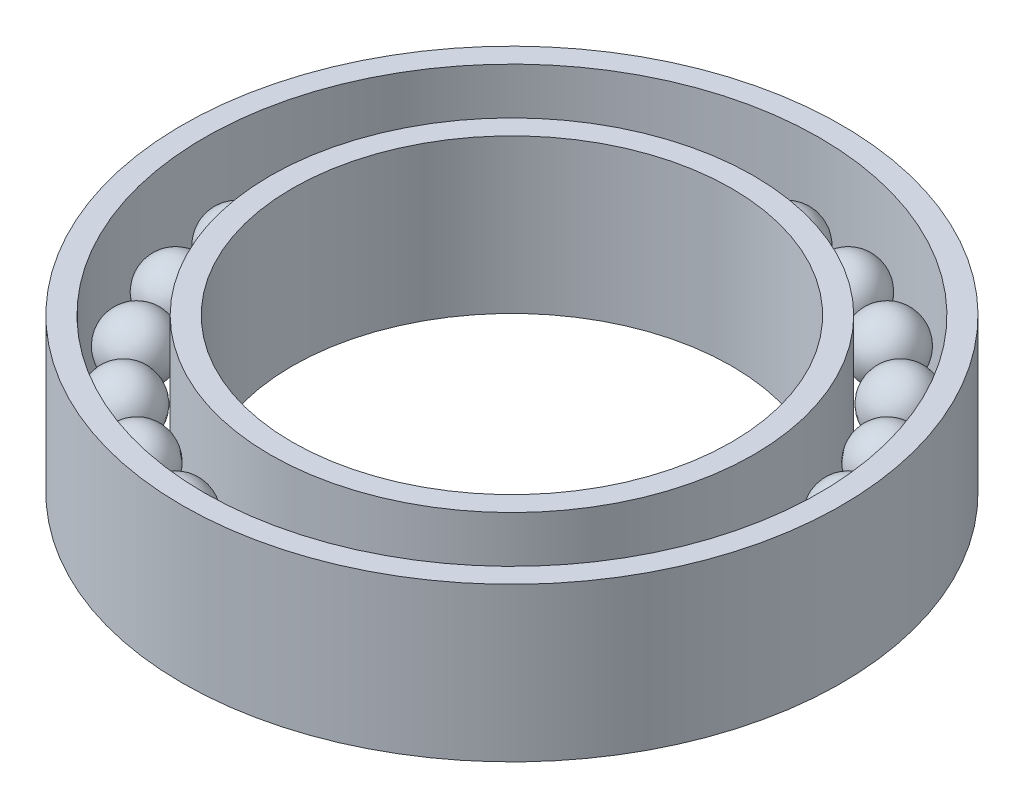
ISO-10303-21;
HEADER;
FILE_DESCRIPTION(('STEP AP214'),'2;1');
FILE_NAME('part.step','',(''),(''),'','','');
FILE_SCHEMA(('AUTOMOTIVE_DESIGN { 1 0 10303 214 1 1 1 1 }'));
ENDSEC;
DATA;
#1=APPLICATION_CONTEXT('core data for automotive mechanical design processes');
#2=APPLICATION_PROTOCOL_DEFINITION('international standard','automotive_design',2000,#1);
#3=PRODUCT_CONTEXT('',#1,'mechanical');
#4=PRODUCT('Part','Part','',(#3));
#5=PRODUCT_RELATED_PRODUCT_CATEGORY('part','',(#4));
#6=PRODUCT_DEFINITION_FORMATION('','',#4);
#7=PRODUCT_DEFINITION_CONTEXT('part definition',#1,'design');
#8=PRODUCT_DEFINITION('design','',#6,#7);
#9=PRODUCT_DEFINITION_SHAPE('','',#8);
#10=(LENGTH_UNIT() NAMED_UNIT(*) SI_UNIT(.MILLI.,.METRE.));
#11=(NAMED_UNIT(*) PLANE_ANGLE_UNIT() SI_UNIT($,.RADIAN.));
#12=(NAMED_UNIT(*) SI_UNIT($,.STERADIAN.) SOLID_ANGLE_UNIT());
#13=UNCERTAINTY_MEASURE_WITH_UNIT(LENGTH_MEASURE(1.E-05),#10,'distance_accuracy_value','');
#14=(GEOMETRIC_REPRESENTATION_CONTEXT(3) GLOBAL_UNCERTAINTY_ASSIGNED_CONTEXT((#13)) GLOBAL_UNIT_ASSIGNED_CONTEXT((#10,
#11,#12)) REPRESENTATION_CONTEXT('',''));
#15=CARTESIAN_POINT('',(0.,0.,0.));
#16=DIRECTION('',(0.,0.,1.));
#17=DIRECTION('',(1.,0.,0.));
#18=AXIS2_PLACEMENT_3D('',#15,#16,#17);
#19=CARTESIAN_POINT('',(0.,-3.5,0.));
#20=DIRECTION('',(0.,1.,0.));
#21=DIRECTION('',(0.,0.,1.));
#22=AXIS2_PLACEMENT_3D('',#19,#20,#21);
#23=CYLINDRICAL_SURFACE('',#22,14.);
#24=CARTESIAN_POINT('',(0.,-3.5,0.));
#25=DIRECTION('',(0.,1.,0.));
#26=DIRECTION('',(0.,0.,1.));
#27=AXIS2_PLACEMENT_3D('',#24,#25,#26);
#28=CIRCLE('',#27,14.);
#29=CARTESIAN_POINT('',(0.,-3.5,14.));
#30=VERTEX_POINT('',#29);
#31=EDGE_CURVE('P0_E21',#30,#30,#28,.T.);
#32=ORIENTED_EDGE('',*,*,#31,.F.);
#33=EDGE_LOOP('',(#32));
#34=FACE_BOUND('',#33,.T.);
#35=CARTESIAN_POINT('',(0.,3.5,0.));
#36=DIRECTION('',(0.,1.,0.));
#37=DIRECTION('',(0.,0.,1.));
#38=AXIS2_PLACEMENT_3D('',#35,#36,#37);
#39=CIRCLE('',#38,14.);
#40=CARTESIAN_POINT('',(0.,3.5,14.));
#41=VERTEX_POINT('',#40);
#42=EDGE_CURVE('P0_E32',#41,#41,#39,.T.);
#43=ORIENTED_EDGE('',*,*,#42,.T.);
#44=EDGE_LOOP('',(#43));
#45=FACE_BOUND('',#44,.T.);
#46=ADVANCED_FACE('P0_F14',(#34,#45),#23,.F.);
#47=CARTESIAN_POINT('',(0.,-3.5,0.));
#48=DIRECTION('',(0.,1.,0.));
#49=DIRECTION('',(0.,0.,1.));
#50=AXIS2_PLACEMENT_3D('',#47,#48,#49);
#51=CYLINDRICAL_SURFACE('',#50,15.);
#52=CARTESIAN_POINT('',(0.,-3.5,0.));
#53=DIRECTION('',(0.,1.,0.));
#54=DIRECTION('',(0.,0.,1.));
#55=AXIS2_PLACEMENT_3D('',#52,#53,#54);
#56=CIRCLE('',#55,15.);
#57=CARTESIAN_POINT('',(0.,-3.5,15.));
#58=VERTEX_POINT('',#57);
#59=EDGE_CURVE('P0_E9',#58,#58,#56,.T.);
#60=ORIENTED_EDGE('',*,*,#59,.T.);
#61=EDGE_LOOP('',(#60));
#62=FACE_BOUND('',#61,.T.);
#63=CARTESIAN_POINT('',(0.,3.5,0.));
#64=DIRECTION('',(0.,1.,0.));
#65=DIRECTION('',(0.,0.,1.));
#66=AXIS2_PLACEMENT_3D('',#63,#64,#65);
#67=CIRCLE('',#66,15.);
#68=CARTESIAN_POINT('',(0.,3.5,15.));
#69=VERTEX_POINT('',#68);
#70=EDGE_CURVE('P0_E27',#69,#69,#67,.T.);
#71=ORIENTED_EDGE('',*,*,#70,.F.);
#72=EDGE_LOOP('',(#71));
#73=FACE_BOUND('',#72,.T.);
#74=ADVANCED_FACE('P0_F47',(#62,#73),#51,.T.);
#75=CARTESIAN_POINT('',(0.,-3.5,0.));
#76=DIRECTION('',(0.,1.,0.));
#77=DIRECTION('',(0.,0.,1.));
#78=AXIS2_PLACEMENT_3D('',#75,#76,#77);
#79=PLANE('',#78);
#80=ORIENTED_EDGE('',*,*,#31,.T.);
#81=EDGE_LOOP('',(#80));
#82=FACE_BOUND('',#81,.T.);
#83=ORIENTED_EDGE('',*,*,#59,.F.);
#84=EDGE_LOOP('',(#83));
#85=FACE_BOUND('',#84,.T.);
#86=ADVANCED_FACE('P0_F43',(#82,#85),#79,.F.);
#87=CARTESIAN_POINT('',(0.,3.5,0.));
#88=DIRECTION('',(0.,1.,0.));
#89=DIRECTION('',(0.,0.,1.));
#90=AXIS2_PLACEMENT_3D('',#87,#88,#89);
#91=PLANE('',#90);
#92=ORIENTED_EDGE('',*,*,#42,.F.);
#93=EDGE_LOOP('',(#92));
#94=FACE_BOUND('',#93,.T.);
#95=ORIENTED_EDGE('',*,*,#70,.T.);
#96=EDGE_LOOP('',(#95));
#97=FACE_BOUND('',#96,.T.);
#98=ADVANCED_FACE('P0_F40',(#94,#97),#91,.T.);
#99=CLOSED_SHELL('',(#46,#74,#86,#98));
#100=MANIFOLD_SOLID_BREP('P0_B1',#99);
#101=CARTESIAN_POINT('',(-12.0740728286133,0.,3.23523806378156));
#102=DIRECTION('',(-0.258819045102525,0.,-0.965925826289067));
#103=DIRECTION('',(0.965925826289067,0.,-0.258819045102525));
#104=AXIS2_PLACEMENT_3D('',#101,#102,#103);
#105=SPHERICAL_SURFACE('',#104,1.46249191736685);
#106=CARTESIAN_POINT('',(-12.4525935901364,0.,1.8225793500579));
#107=VERTEX_POINT('',#106);
#108=VERTEX_LOOP('',#107);
#109=FACE_BOUND('',#108,.T.);
#110=ADVANCED_FACE('P1_F13',(#109),#105,.T.);
#111=CLOSED_SHELL('',(#110));
#112=MANIFOLD_SOLID_BREP('P1_B1',#111);
#113=CARTESIAN_POINT('',(-10.8253175473055,0.,6.25));
#114=DIRECTION('',(-0.5,0.,-0.866025403784437));
#115=DIRECTION('',(0.866025403784437,0.,-0.5));
#116=AXIS2_PLACEMENT_3D('',#113,#114,#115);
#117=SPHERICAL_SURFACE('',#116,1.46249191736685);
#118=CARTESIAN_POINT('',(-11.5565635059889,0.,4.9834448467309));
#119=VERTEX_POINT('',#118);
#120=VERTEX_LOOP('',#119);
#121=FACE_BOUND('',#120,.T.);
#122=ADVANCED_FACE('P2_F13',(#121),#117,.T.);
#123=CLOSED_SHELL('',(#122));
#124=MANIFOLD_SOLID_BREP('P2_B1',#123);
#125=CARTESIAN_POINT('',(-8.8388347648318,0.,8.83883476483189));
#126=DIRECTION('',(-0.707106781186551,0.,-0.707106781186544));
#127=DIRECTION('',(0.707106781186544,0.,-0.707106781186551));
#128=AXIS2_PLACEMENT_3D('',#125,#126,#127);
#129=SPHERICAL_SURFACE('',#128,1.46249191736685);
#130=CARTESIAN_POINT('',(-9.87297271703242,0.,7.80469681263128));
#131=VERTEX_POINT('',#130);
#132=VERTEX_LOOP('',#131);
#133=FACE_BOUND('',#132,.T.);
#134=ADVANCED_FACE('P3_F13',(#133),#129,.T.);
#135=CLOSED_SHELL('',(#134));
#136=MANIFOLD_SOLID_BREP('P3_B1',#135);
#137=CARTESIAN_POINT('',(-6.25,0.,10.8253175473055));
#138=DIRECTION('',(-0.866025403784442,0.,-0.5));
#139=DIRECTION('',(0.5,0.,-0.866025403784442));
#140=AXIS2_PLACEMENT_3D('',#137,#138,#139);
#141=SPHERICAL_SURFACE('',#140,1.46249191736685);
#142=CARTESIAN_POINT('',(-7.51655515326911,0.,10.0940715886221));
#143=VERTEX_POINT('',#142);
#144=VERTEX_LOOP('',#143);
#145=FACE_BOUND('',#144,.T.);
#146=ADVANCED_FACE('P4_F13',(#145),#141,.T.);
#147=CLOSED_SHELL('',(#146));
#148=MANIFOLD_SOLID_BREP('P4_B1',#147);
#149=CARTESIAN_POINT('',(-3.23523806378143,0.,12.0740728286134));
#150=DIRECTION('',(-0.96592582628907,0.,-0.258819045102515));
#151=DIRECTION('',(0.258819045102515,0.,-0.96592582628907));
#152=AXIS2_PLACEMENT_3D('',#149,#150,#151);
#153=SPHERICAL_SURFACE('',#152,1.46249191736685);
#154=CARTESIAN_POINT('',(-4.6478967775051,0.,11.6955520670903));
#155=VERTEX_POINT('',#154);
#156=VERTEX_LOOP('',#155);
#157=FACE_BOUND('',#156,.T.);
#158=ADVANCED_FACE('P5_F13',(#157),#153,.T.);
#159=CLOSED_SHELL('',(#158));
#160=MANIFOLD_SOLID_BREP('P5_B1',#159);
#161=CARTESIAN_POINT('',(0.,0.,12.5));
#162=DIRECTION('',(-1.,0.,0.));
#163=DIRECTION('',(0.,0.,-1.));
#164=AXIS2_PLACEMENT_3D('',#161,#162,#163);
#165=SPHERICAL_SURFACE('',#164,1.46249191736685);
#166=CARTESIAN_POINT('',(-1.46249191736685,0.,12.5));
#167=VERTEX_POINT('',#166);
#168=VERTEX_LOOP('',#167);
#169=FACE_BOUND('',#168,.T.);
#170=ADVANCED_FACE('P6_F13',(#169),#165,.T.);
#171=CLOSED_SHELL('',(#170));
#172=MANIFOLD_SOLID_BREP('P6_B1',#171);
#173=CARTESIAN_POINT('',(3.2352380637816,0.,12.0740728286133));
#174=DIRECTION('',(-0.965925826289066,0.,0.258819045102528));
#175=DIRECTION('',(-0.258819045102528,0.,-0.965925826289066));
#176=AXIS2_PLACEMENT_3D('',#173,#174,#175);
#177=SPHERICAL_SURFACE('',#176,1.46249191736685);
#178=CARTESIAN_POINT('',(1.82257935005794,0.,12.4525935901364));
#179=VERTEX_POINT('',#178);
#180=VERTEX_LOOP('',#179);
#181=FACE_BOUND('',#180,.T.);
#182=ADVANCED_FACE('P7_F13',(#181),#177,.T.);
#183=CLOSED_SHELL('',(#182));
#184=MANIFOLD_SOLID_BREP('P7_B1',#183);
#185=CARTESIAN_POINT('',(6.25000000000009,0.,10.8253175473054));
#186=DIRECTION('',(-0.866025403784435,0.,0.500000000000007));
#187=DIRECTION('',(-0.500000000000007,0.,-0.866025403784435));
#188=AXIS2_PLACEMENT_3D('',#185,#186,#187);
#189=SPHERICAL_SURFACE('',#188,1.46249191736685);
#190=CARTESIAN_POINT('',(4.98344484673099,0.,11.5565635059889));
#191=VERTEX_POINT('',#190);
#192=VERTEX_LOOP('',#191);
#193=FACE_BOUND('',#192,.T.);
#194=ADVANCED_FACE('P8_F13',(#193),#189,.T.);
#195=CLOSED_SHELL('',(#194));
#196=MANIFOLD_SOLID_BREP('P8_B1',#195);
#197=CARTESIAN_POINT('',(8.83883476483192,0.,8.83883476483177));
#198=DIRECTION('',(-0.707106781186541,0.,0.707106781186554));
#199=DIRECTION('',(-0.707106781186554,0.,-0.707106781186541));
#200=AXIS2_PLACEMENT_3D('',#197,#198,#199);
#201=SPHERICAL_SURFACE('',#200,1.46249191736685);
#202=CARTESIAN_POINT('',(7.80469681263131,0.,9.8729727170324));
#203=VERTEX_POINT('',#202);
#204=VERTEX_LOOP('',#203);
#205=FACE_BOUND('',#204,.T.);
#206=ADVANCED_FACE('P9_F13',(#205),#201,.T.);
#207=CLOSED_SHELL('',(#206));
#208=MANIFOLD_SOLID_BREP('P9_B1',#207);
#209=CARTESIAN_POINT('',(10.8253175473055,0.,6.2499999999999));
#210=DIRECTION('',(-0.499999999999992,0.,0.866025403784443));
#211=DIRECTION('',(-0.866025403784443,0.,-0.499999999999992));
#212=AXIS2_PLACEMENT_3D('',#209,#210,#211);
#213=SPHERICAL_SURFACE('',#212,1.46249191736685);
#214=CARTESIAN_POINT('',(10.0940715886221,0.,7.51655515326901));
#215=VERTEX_POINT('',#214);
#216=VERTEX_LOOP('',#215);
#217=FACE_BOUND('',#216,.T.);
#218=ADVANCED_FACE('P10_F13',(#217),#213,.T.);
#219=CLOSED_SHELL('',(#218));
#220=MANIFOLD_SOLID_BREP('P10_B1',#219);
#221=CARTESIAN_POINT('',(0.,-3.5,0.));
#222=DIRECTION('',(0.,1.,0.));
#223=DIRECTION('',(0.,0.,1.));
#224=AXIS2_PLACEMENT_3D('',#221,#222,#223);
#225=CYLINDRICAL_SURFACE('',#224,10.);
#226=CARTESIAN_POINT('',(0.,-3.5,0.));
#227=DIRECTION('',(0.,1.,0.));
#228=DIRECTION('',(0.,0.,1.));
#229=AXIS2_PLACEMENT_3D('',#226,#227,#228);
#230=CIRCLE('',#229,10.);
#231=CARTESIAN_POINT('',(0.,-3.5,10.));
#232=VERTEX_POINT('',#231);
#233=EDGE_CURVE('P11_E21',#232,#232,#230,.T.);
#234=ORIENTED_EDGE('',*,*,#233,.F.);
#235=EDGE_LOOP('',(#234));
#236=FACE_BOUND('',#235,.T.);
#237=CARTESIAN_POINT('',(0.,3.5,0.));
#238=DIRECTION('',(0.,1.,0.));
#239=DIRECTION('',(0.,0.,1.));
#240=AXIS2_PLACEMENT_3D('',#237,#238,#239);
#241=CIRCLE('',#240,10.);
#242=CARTESIAN_POINT('',(0.,3.5,10.));
#243=VERTEX_POINT('',#242);
#244=EDGE_CURVE('P11_E29',#243,#243,#241,.T.);
#245=ORIENTED_EDGE('',*,*,#244,.T.);
#246=EDGE_LOOP('',(#245));
#247=FACE_BOUND('',#246,.T.);
#248=ADVANCED_FACE('P11_F15',(#236,#247),#225,.F.);
#249=CARTESIAN_POINT('',(0.,-3.5,0.));
#250=DIRECTION('',(0.,1.,0.));
#251=DIRECTION('',(0.,0.,1.));
#252=AXIS2_PLACEMENT_3D('',#249,#250,#251);
#253=CYLINDRICAL_SURFACE('',#252,11.);
#254=CARTESIAN_POINT('',(0.,-3.5,0.));
#255=DIRECTION('',(0.,1.,0.));
#256=DIRECTION('',(0.,0.,1.));
#257=AXIS2_PLACEMENT_3D('',#254,#255,#256);
#258=CIRCLE('',#257,11.);
#259=CARTESIAN_POINT('',(0.,-3.5,11.));
#260=VERTEX_POINT('',#259);
#261=EDGE_CURVE('P11_E10',#260,#260,#258,.T.);
#262=ORIENTED_EDGE('',*,*,#261,.T.);
#263=EDGE_LOOP('',(#262));
#264=FACE_BOUND('',#263,.T.);
#265=CARTESIAN_POINT('',(0.,3.5,0.));
#266=DIRECTION('',(0.,1.,0.));
#267=DIRECTION('',(0.,0.,1.));
#268=AXIS2_PLACEMENT_3D('',#265,#266,#267);
#269=CIRCLE('',#268,11.);
#270=CARTESIAN_POINT('',(0.,3.5,11.));
#271=VERTEX_POINT('',#270);
#272=EDGE_CURVE('P11_E25',#271,#271,#269,.T.);
#273=ORIENTED_EDGE('',*,*,#272,.F.);
#274=EDGE_LOOP('',(#273));
#275=FACE_BOUND('',#274,.T.);
#276=ADVANCED_FACE('P11_F43',(#264,#275),#253,.T.);
#277=CARTESIAN_POINT('',(0.,-3.5,0.));
#278=DIRECTION('',(0.,1.,0.));
#279=DIRECTION('',(0.,0.,1.));
#280=AXIS2_PLACEMENT_3D('',#277,#278,#279);
#281=PLANE('',#280);
#282=ORIENTED_EDGE('',*,*,#233,.T.);
#283=EDGE_LOOP('',(#282));
#284=FACE_BOUND('',#283,.T.);
#285=ORIENTED_EDGE('',*,*,#261,.F.);
#286=EDGE_LOOP('',(#285));
#287=FACE_BOUND('',#286,.T.);
#288=ADVANCED_FACE('P11_F39',(#284,#287),#281,.F.);
#289=CARTESIAN_POINT('',(0.,3.5,0.));
#290=DIRECTION('',(0.,1.,0.));
#291=DIRECTION('',(0.,0.,1.));
#292=AXIS2_PLACEMENT_3D('',#289,#290,#291);
#293=PLANE('',#292);
#294=ORIENTED_EDGE('',*,*,#244,.F.);
#295=EDGE_LOOP('',(#294));
#296=FACE_BOUND('',#295,.T.);
#297=ORIENTED_EDGE('',*,*,#272,.T.);
#298=EDGE_LOOP('',(#297));
#299=FACE_BOUND('',#298,.T.);
#300=ADVANCED_FACE('P11_F36',(#296,#299),#293,.T.);
#301=CLOSED_SHELL('',(#248,#276,#288,#300));
#302=MANIFOLD_SOLID_BREP('P11_B1',#301);
#303=CARTESIAN_POINT('',(12.0740728286134,0.,3.23523806378139));
#304=DIRECTION('',(-0.258819045102511,0.,0.965925826289071));
#305=DIRECTION('',(-0.965925826289071,0.,-0.258819045102511));
#306=AXIS2_PLACEMENT_3D('',#303,#304,#305);
#307=SPHERICAL_SURFACE('',#306,1.46249191736685);
#308=CARTESIAN_POINT('',(11.6955520670904,0.,4.64789677750506));
#309=VERTEX_POINT('',#308);
#310=VERTEX_LOOP('',#309);
#311=FACE_BOUND('',#310,.T.);
#312=ADVANCED_FACE('P12_F13',(#311),#307,.T.);
#313=CLOSED_SHELL('',(#312));
#314=MANIFOLD_SOLID_BREP('P12_B1',#313);
#315=CARTESIAN_POINT('',(12.5,0.,-1.30930550206617E-13));
#316=DIRECTION('',(0.,0.,1.));
#317=DIRECTION('',(-1.,0.,0.));
#318=AXIS2_PLACEMENT_3D('',#315,#316,#317);
#319=SPHERICAL_SURFACE('',#318,1.46249191736685);
#320=CARTESIAN_POINT('',(12.5,0.,1.46249191736672));
#321=VERTEX_POINT('',#320);
#322=VERTEX_LOOP('',#321);
#323=FACE_BOUND('',#322,.T.);
#324=ADVANCED_FACE('P13_F13',(#323),#319,.T.);
#325=CLOSED_SHELL('',(#324));
#326=MANIFOLD_SOLID_BREP('P13_B1',#325);
#327=CARTESIAN_POINT('',(12.0740728286133,0.,-3.23523806378165));
#328=DIRECTION('',(0.258819045102532,0.,0.965925826289065));
#329=DIRECTION('',(-0.965925826289065,0.,0.258819045102532));
#330=AXIS2_PLACEMENT_3D('',#327,#328,#329);
#331=SPHERICAL_SURFACE('',#330,1.46249191736685);
#332=CARTESIAN_POINT('',(12.4525935901364,0.,-1.82257935005799));
#333=VERTEX_POINT('',#332);
#334=VERTEX_LOOP('',#333);
#335=FACE_BOUND('',#334,.T.);
#336=ADVANCED_FACE('P14_F13',(#335),#331,.T.);
#337=CLOSED_SHELL('',(#336));
#338=MANIFOLD_SOLID_BREP('P14_B1',#337);
#339=CARTESIAN_POINT('',(10.8253175473054,0.,-6.25000000000013));
#340=DIRECTION('',(0.50000000000001,0.,0.866025403784433));
#341=DIRECTION('',(-0.866025403784433,0.,0.50000000000001));
#342=AXIS2_PLACEMENT_3D('',#339,#340,#341);
#343=SPHERICAL_SURFACE('',#342,1.46249191736685);
#344=CARTESIAN_POINT('',(11.5565635059888,0.,-4.98344484673103));
#345=VERTEX_POINT('',#344);
#346=VERTEX_LOOP('',#345);
#347=FACE_BOUND('',#346,.T.);
#348=ADVANCED_FACE('P15_F13',(#347),#343,.T.);
#349=CLOSED_SHELL('',(#348));
#350=MANIFOLD_SOLID_BREP('P15_B1',#349);
#351=CARTESIAN_POINT('',(8.83883476483174,0.,-8.83883476483195));
#352=DIRECTION('',(0.707106781186556,0.,0.707106781186539));
#353=DIRECTION('',(-0.707106781186539,0.,0.707106781186556));
#354=AXIS2_PLACEMENT_3D('',#351,#352,#353);
#355=SPHERICAL_SURFACE('',#354,1.46249191736685);
#356=CARTESIAN_POINT('',(9.87297271703237,0.,-7.80469681263135));
#357=VERTEX_POINT('',#356);
#358=VERTEX_LOOP('',#357);
#359=FACE_BOUND('',#358,.T.);
#360=ADVANCED_FACE('P16_F13',(#359),#355,.T.);
#361=CLOSED_SHELL('',(#360));
#362=MANIFOLD_SOLID_BREP('P16_B1',#361);
#363=CARTESIAN_POINT('',(6.24999999999986,0.,-10.8253175473056));
#364=DIRECTION('',(0.866025403784445,0.,0.499999999999989));
#365=DIRECTION('',(-0.499999999999989,0.,0.866025403784445));
#366=AXIS2_PLACEMENT_3D('',#363,#364,#365);
#367=SPHERICAL_SURFACE('',#366,1.46249191736685);
#368=CARTESIAN_POINT('',(7.51655515326898,0.,-10.0940715886222));
#369=VERTEX_POINT('',#368);
#370=VERTEX_LOOP('',#369);
#371=FACE_BOUND('',#370,.T.);
#372=ADVANCED_FACE('P17_F13',(#371),#367,.T.);
#373=CLOSED_SHELL('',(#372));
#374=MANIFOLD_SOLID_BREP('P17_B1',#373);
#375=CARTESIAN_POINT('',(3.23523806378135,0.,-12.0740728286134));
#376=DIRECTION('',(0.965925826289072,0.,0.258819045102508));
#377=DIRECTION('',(-0.258819045102508,0.,0.965925826289072));
#378=AXIS2_PLACEMENT_3D('',#375,#376,#377);
#379=SPHERICAL_SURFACE('',#378,1.46249191736685);
#380=CARTESIAN_POINT('',(4.64789677750502,0.,-11.6955520670904));
#381=VERTEX_POINT('',#380);
#382=VERTEX_LOOP('',#381);
#383=FACE_BOUND('',#382,.T.);
#384=ADVANCED_FACE('P18_F13',(#383),#379,.T.);
#385=CLOSED_SHELL('',(#384));
#386=MANIFOLD_SOLID_BREP('P18_B1',#385);
#387=CARTESIAN_POINT('',(0.,0.,-12.5));
#388=DIRECTION('',(1.,0.,0.));
#389=DIRECTION('',(0.,0.,1.));
#390=AXIS2_PLACEMENT_3D('',#387,#388,#389);
#391=SPHERICAL_SURFACE('',#390,1.46249191736685);
#392=CARTESIAN_POINT('',(1.46249191736685,0.,-12.5));
#393=VERTEX_POINT('',#392);
#394=VERTEX_LOOP('',#393);
#395=FACE_BOUND('',#394,.T.);
#396=ADVANCED_FACE('P19_F13',(#395),#391,.T.);
#397=CLOSED_SHELL('',(#396));
#398=MANIFOLD_SOLID_BREP('P19_B1',#397);
#399=CARTESIAN_POINT('',(-3.23523806378169,0.,-12.0740728286133));
#400=DIRECTION('',(0.965925826289065,0.,-0.258819045102535));
#401=DIRECTION('',(0.258819045102535,0.,0.965925826289065));
#402=AXIS2_PLACEMENT_3D('',#399,#400,#401);
#403=SPHERICAL_SURFACE('',#402,1.46249191736685);
#404=CARTESIAN_POINT('',(-1.82257935005803,0.,-12.4525935901364));
#405=VERTEX_POINT('',#404);
#406=VERTEX_LOOP('',#405);
#407=FACE_BOUND('',#406,.T.);
#408=ADVANCED_FACE('P20_F13',(#407),#403,.T.);
#409=CLOSED_SHELL('',(#408));
#410=MANIFOLD_SOLID_BREP('P20_B1',#409);
#411=CARTESIAN_POINT('',(-6.25000000000017,0.,-10.8253175473054));
#412=DIRECTION('',(0.866025403784431,0.,-0.500000000000013));
#413=DIRECTION('',(0.500000000000013,0.,0.866025403784431));
#414=AXIS2_PLACEMENT_3D('',#411,#412,#413);
#415=SPHERICAL_SURFACE('',#414,1.46249191736685);
#416=CARTESIAN_POINT('',(-4.98344484673107,0.,-11.5565635059888));
#417=VERTEX_POINT('',#416);
#418=VERTEX_LOOP('',#417);
#419=FACE_BOUND('',#418,.T.);
#420=ADVANCED_FACE('P21_F13',(#419),#415,.T.);
#421=CLOSED_SHELL('',(#420));
#422=MANIFOLD_SOLID_BREP('P21_B1',#421);
#423=CARTESIAN_POINT('',(0.,0.,-12.5));
#424=DIRECTION('',(1.,0.,0.));
#425=DIRECTION('',(0.,0.,1.));
#426=AXIS2_PLACEMENT_3D('',#423,#424,#425);
#427=SPHERICAL_SURFACE('',#426,1.46249191736685);
#428=CARTESIAN_POINT('',(1.46249191736685,0.,-12.5));
#429=VERTEX_POINT('',#428);
#430=VERTEX_LOOP('',#429);
#431=FACE_BOUND('',#430,.T.);
#432=ADVANCED_FACE('P22_F13',(#431),#427,.T.);
#433=CLOSED_SHELL('',(#432));
#434=MANIFOLD_SOLID_BREP('P22_B1',#433);
#435=CARTESIAN_POINT('',(-8.83883476483198,0.,-8.83883476483171));
#436=DIRECTION('',(0.707106781186536,0.,-0.707106781186559));
#437=DIRECTION('',(0.707106781186559,0.,0.707106781186536));
#438=AXIS2_PLACEMENT_3D('',#435,#436,#437);
#439=SPHERICAL_SURFACE('',#438,1.46249191736685);
#440=CARTESIAN_POINT('',(-7.80469681263138,0.,-9.87297271703235));
#441=VERTEX_POINT('',#440);
#442=VERTEX_LOOP('',#441);
#443=FACE_BOUND('',#442,.T.);
#444=ADVANCED_FACE('P23_F13',(#443),#439,.T.);
#445=CLOSED_SHELL('',(#444));
#446=MANIFOLD_SOLID_BREP('P23_B1',#445);
#447=CARTESIAN_POINT('',(-10.8253175473056,0.,-6.24999999999982));
#448=DIRECTION('',(0.499999999999986,0.,-0.866025403784447));
#449=DIRECTION('',(0.866025403784447,0.,0.499999999999986));
#450=AXIS2_PLACEMENT_3D('',#447,#448,#449);
#451=SPHERICAL_SURFACE('',#450,1.46249191736685);
#452=CARTESIAN_POINT('',(-10.0940715886222,0.,-7.51655515326894));
#453=VERTEX_POINT('',#452);
#454=VERTEX_LOOP('',#453);
#455=FACE_BOUND('',#454,.T.);
#456=ADVANCED_FACE('P24_F13',(#455),#451,.T.);
#457=CLOSED_SHELL('',(#456));
#458=MANIFOLD_SOLID_BREP('P24_B1',#457);
#459=CARTESIAN_POINT('',(-12.0740728286134,0.,-3.2352380637813));
#460=DIRECTION('',(0.258819045102505,0.,-0.965925826289073));
#461=DIRECTION('',(0.965925826289073,0.,0.258819045102505));
#462=AXIS2_PLACEMENT_3D('',#459,#460,#461);
#463=SPHERICAL_SURFACE('',#462,1.46249191736685);
#464=CARTESIAN_POINT('',(-11.6955520670904,0.,-4.64789677750497));
#465=VERTEX_POINT('',#464);
#466=VERTEX_LOOP('',#465);
#467=FACE_BOUND('',#466,.T.);
#468=ADVANCED_FACE('P25_F13',(#467),#463,.T.);
#469=CLOSED_SHELL('',(#468));
#470=MANIFOLD_SOLID_BREP('P25_B1',#469);
#471=CARTESIAN_POINT('',(-6.25,0.,-10.8253175473055));
#472=DIRECTION('',(0.866025403784438,0.,-0.5));
#473=DIRECTION('',(0.5,0.,0.866025403784438));
#474=AXIS2_PLACEMENT_3D('',#471,#472,#473);
#475=SPHERICAL_SURFACE('',#474,1.46249191736685);
#476=CARTESIAN_POINT('',(-4.98344484673089,0.,-11.5565635059889));
#477=VERTEX_POINT('',#476);
#478=VERTEX_LOOP('',#477);
#479=FACE_BOUND('',#478,.T.);
#480=ADVANCED_FACE('P26_F13',(#479),#475,.T.);
#481=CLOSED_SHELL('',(#480));
#482=MANIFOLD_SOLID_BREP('P26_B1',#481);
#483=CARTESIAN_POINT('',(-8.83883476483186,0.,-8.83883476483183));
#484=DIRECTION('',(0.707106781186546,0.,-0.707106781186549));
#485=DIRECTION('',(0.707106781186549,0.,0.707106781186546));
#486=AXIS2_PLACEMENT_3D('',#483,#484,#485);
#487=SPHERICAL_SURFACE('',#486,1.46249191736685);
#488=CARTESIAN_POINT('',(-7.80469681263124,0.,-9.87297271703245));
#489=VERTEX_POINT('',#488);
#490=VERTEX_LOOP('',#489);
#491=FACE_BOUND('',#490,.T.);
#492=ADVANCED_FACE('P27_F13',(#491),#487,.T.);
#493=CLOSED_SHELL('',(#492));
#494=MANIFOLD_SOLID_BREP('P27_B1',#493);
#495=CARTESIAN_POINT('',(-10.8253175473055,0.,-6.25));
#496=DIRECTION('',(0.5,0.,-0.86602540378444));
#497=DIRECTION('',(0.86602540378444,0.,0.5));
#498=AXIS2_PLACEMENT_3D('',#495,#496,#497);
#499=SPHERICAL_SURFACE('',#498,1.46249191736685);
#500=CARTESIAN_POINT('',(-10.0940715886221,0.,-7.51655515326911));
#501=VERTEX_POINT('',#500);
#502=VERTEX_LOOP('',#501);
#503=FACE_BOUND('',#502,.T.);
#504=ADVANCED_FACE('P28_F13',(#503),#499,.T.);
#505=CLOSED_SHELL('',(#504));
#506=MANIFOLD_SOLID_BREP('P28_B1',#505);
#507=CARTESIAN_POINT('',(-12.0740728286134,0.,-3.23523806378148));
#508=DIRECTION('',(0.258819045102518,0.,-0.965925826289069));
#509=DIRECTION('',(0.965925826289069,0.,0.258819045102518));
#510=AXIS2_PLACEMENT_3D('',#507,#508,#509);
#511=SPHERICAL_SURFACE('',#510,1.46249191736685);
#512=CARTESIAN_POINT('',(-11.6955520670903,0.,-4.64789677750514));
#513=VERTEX_POINT('',#512);
#514=VERTEX_LOOP('',#513);
#515=FACE_BOUND('',#514,.T.);
#516=ADVANCED_FACE('P29_F13',(#515),#511,.T.);
#517=CLOSED_SHELL('',(#516));
#518=MANIFOLD_SOLID_BREP('P29_B1',#517);
#519=CARTESIAN_POINT('',(-12.5,0.,0.));
#520=DIRECTION('',(0.,0.,-1.));
#521=DIRECTION('',(1.,0.,0.));
#522=AXIS2_PLACEMENT_3D('',#519,#520,#521);
#523=SPHERICAL_SURFACE('',#522,1.46249191736685);
#524=CARTESIAN_POINT('',(-12.5,0.,-1.46249191736681));
#525=VERTEX_POINT('',#524);
#526=VERTEX_LOOP('',#525);
#527=FACE_BOUND('',#526,.T.);
#528=ADVANCED_FACE('P30_F13',(#527),#523,.T.);
#529=CLOSED_SHELL('',(#528));
#530=MANIFOLD_SOLID_BREP('P30_B1',#529);
#531=ADVANCED_BREP_SHAPE_REPRESENTATION('',(#18,#100,#112,#124,#136,#148,#160,#172,#184,#196,
#208,#220,#302,#314,#326,#338,#350,#362,#374,#386,#398,#410,#422,#434,#446,#458,#470,#482,#494,
#506,#518,#530),#14);
#532=SHAPE_DEFINITION_REPRESENTATION(#9,#531);
ENDSEC;
END-ISO-10303-21;
